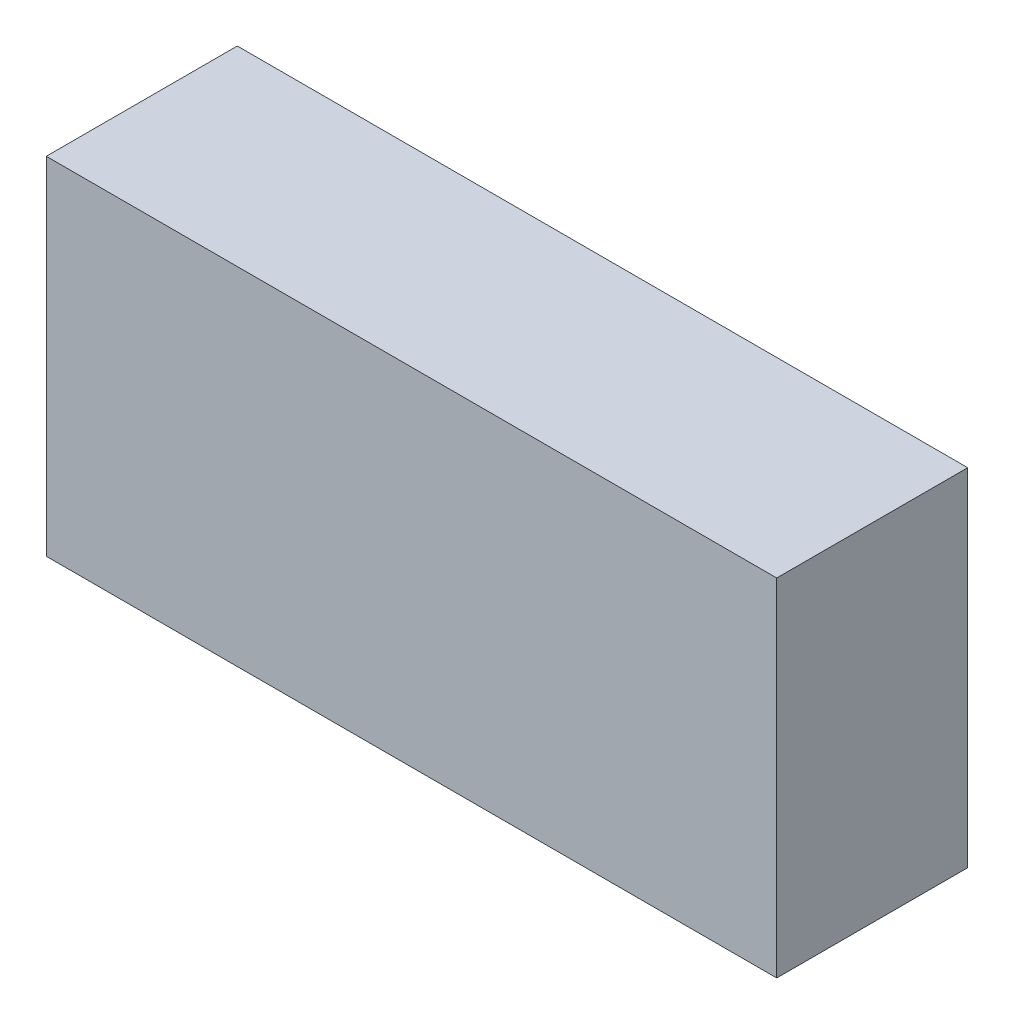
ISO-10303-21;
HEADER;
FILE_DESCRIPTION(('STEP AP214'),'2;1');
FILE_NAME('part.step','',(''),(''),'','','');
FILE_SCHEMA(('AUTOMOTIVE_DESIGN { 1 0 10303 214 1 1 1 1 }'));
ENDSEC;
DATA;
#1=APPLICATION_CONTEXT('core data for automotive mechanical design processes');
#2=APPLICATION_PROTOCOL_DEFINITION('international standard','automotive_design',2000,#1);
#3=PRODUCT_CONTEXT('',#1,'mechanical');
#4=PRODUCT('Part','Part','',(#3));
#5=PRODUCT_RELATED_PRODUCT_CATEGORY('part','',(#4));
#6=PRODUCT_DEFINITION_FORMATION('','',#4);
#7=PRODUCT_DEFINITION_CONTEXT('part definition',#1,'design');
#8=PRODUCT_DEFINITION('design','',#6,#7);
#9=PRODUCT_DEFINITION_SHAPE('','',#8);
#10=(LENGTH_UNIT() NAMED_UNIT(*) SI_UNIT(.MILLI.,.METRE.));
#11=(NAMED_UNIT(*) PLANE_ANGLE_UNIT() SI_UNIT($,.RADIAN.));
#12=(NAMED_UNIT(*) SI_UNIT($,.STERADIAN.) SOLID_ANGLE_UNIT());
#13=UNCERTAINTY_MEASURE_WITH_UNIT(LENGTH_MEASURE(1.E-05),#10,'distance_accuracy_value','');
#14=(GEOMETRIC_REPRESENTATION_CONTEXT(3) GLOBAL_UNCERTAINTY_ASSIGNED_CONTEXT((#13)) GLOBAL_UNIT_ASSIGNED_CONTEXT((#10,
#11,#12)) REPRESENTATION_CONTEXT('',''));
#15=CARTESIAN_POINT('',(0.,0.,0.));
#16=DIRECTION('',(0.,0.,1.));
#17=DIRECTION('',(1.,0.,0.));
#18=AXIS2_PLACEMENT_3D('',#15,#16,#17);
#19=CARTESIAN_POINT('',(-116.51078896083,39.9097499999997,-30.3276));
#20=DIRECTION('',(-1.,0.,0.));
#21=DIRECTION('',(0.,-1.,0.));
#22=AXIS2_PLACEMENT_3D('',#19,#20,#21);
#23=PLANE('',#22);
#24=DIRECTION('',(0.,0.,1.));
#25=VECTOR('',#24,1.);
#26=CARTESIAN_POINT('',(-116.51078896083,-65.5002500000003,-30.3276));
#27=LINE('',#26,#25);
#28=CARTESIAN_POINT('',(-116.51078896083,-65.5002500000003,-30.3276));
#29=VERTEX_POINT('',#28);
#30=CARTESIAN_POINT('',(-116.51078896083,-65.5002500000003,27.7876));
#31=VERTEX_POINT('',#30);
#32=EDGE_CURVE('E47',#29,#31,#27,.T.);
#33=ORIENTED_EDGE('',*,*,#32,.T.);
#34=DIRECTION('',(0.,-1.,0.));
#35=VECTOR('',#34,1.);
#36=CARTESIAN_POINT('',(-116.51078896083,39.9097499999997,27.7876));
#37=LINE('',#36,#35);
#38=CARTESIAN_POINT('',(-116.51078896083,39.9097499999997,27.7876));
#39=VERTEX_POINT('',#38);
#40=EDGE_CURVE('E89',#39,#31,#37,.T.);
#41=ORIENTED_EDGE('',*,*,#40,.F.);
#42=DIRECTION('',(0.,0.,1.));
#43=VECTOR('',#42,1.);
#44=CARTESIAN_POINT('',(-116.51078896083,39.9097499999997,-30.3276));
#45=LINE('',#44,#43);
#46=CARTESIAN_POINT('',(-116.51078896083,39.9097499999997,-30.3276));
#47=VERTEX_POINT('',#46);
#48=EDGE_CURVE('E11',#47,#39,#45,.T.);
#49=ORIENTED_EDGE('',*,*,#48,.F.);
#50=DIRECTION('',(0.,-1.,0.));
#51=VECTOR('',#50,1.);
#52=CARTESIAN_POINT('',(-116.51078896083,39.9097499999997,-30.3276));
#53=LINE('',#52,#51);
#54=EDGE_CURVE('E90',#47,#29,#53,.T.);
#55=ORIENTED_EDGE('',*,*,#54,.T.);
#56=EDGE_LOOP('',(#33,#41,#49,#55));
#57=FACE_BOUND('',#56,.T.);
#58=ADVANCED_FACE('F44',(#57),#23,.T.);
#59=CARTESIAN_POINT('',(-116.51078896083,39.9097499999997,-30.3276));
#60=DIRECTION('',(0.,1.,0.));
#61=DIRECTION('',(0.,0.,1.));
#62=AXIS2_PLACEMENT_3D('',#59,#60,#61);
#63=PLANE('',#62);
#64=ORIENTED_EDGE('',*,*,#48,.T.);
#65=DIRECTION('',(-1.,0.,0.));
#66=VECTOR('',#65,1.);
#67=CARTESIAN_POINT('',(-116.51078896083,39.9097499999997,27.7876));
#68=LINE('',#67,#66);
#69=CARTESIAN_POINT('',(105.73921103917,39.9097499999997,27.7876));
#70=VERTEX_POINT('',#69);
#71=EDGE_CURVE('E106',#70,#39,#68,.T.);
#72=ORIENTED_EDGE('',*,*,#71,.F.);
#73=DIRECTION('',(0.,0.,1.));
#74=VECTOR('',#73,1.);
#75=CARTESIAN_POINT('',(105.73921103917,39.9097499999997,-30.3276));
#76=LINE('',#75,#74);
#77=CARTESIAN_POINT('',(105.73921103917,39.9097499999997,-30.3276));
#78=VERTEX_POINT('',#77);
#79=EDGE_CURVE('E52',#78,#70,#76,.T.);
#80=ORIENTED_EDGE('',*,*,#79,.F.);
#81=DIRECTION('',(-1.,0.,0.));
#82=VECTOR('',#81,1.);
#83=CARTESIAN_POINT('',(-116.51078896083,39.9097499999997,-30.3276));
#84=LINE('',#83,#82);
#85=EDGE_CURVE('E95',#78,#47,#84,.T.);
#86=ORIENTED_EDGE('',*,*,#85,.T.);
#87=EDGE_LOOP('',(#64,#72,#80,#86));
#88=FACE_BOUND('',#87,.T.);
#89=ADVANCED_FACE('F124',(#88),#63,.T.);
#90=CARTESIAN_POINT('',(105.73921103917,39.9097499999997,-30.3276));
#91=DIRECTION('',(1.,0.,0.));
#92=DIRECTION('',(0.,1.,0.));
#93=AXIS2_PLACEMENT_3D('',#90,#91,#92);
#94=PLANE('',#93);
#95=ORIENTED_EDGE('',*,*,#79,.T.);
#96=DIRECTION('',(0.,1.,0.));
#97=VECTOR('',#96,1.);
#98=CARTESIAN_POINT('',(105.73921103917,39.9097499999997,27.7876));
#99=LINE('',#98,#97);
#100=CARTESIAN_POINT('',(105.73921103917,-65.5002500000003,27.7876));
#101=VERTEX_POINT('',#100);
#102=EDGE_CURVE('E102',#101,#70,#99,.T.);
#103=ORIENTED_EDGE('',*,*,#102,.F.);
#104=DIRECTION('',(0.,0.,1.));
#105=VECTOR('',#104,1.);
#106=CARTESIAN_POINT('',(105.73921103917,-65.5002500000003,-30.3276));
#107=LINE('',#106,#105);
#108=CARTESIAN_POINT('',(105.73921103917,-65.5002500000003,-30.3276));
#109=VERTEX_POINT('',#108);
#110=EDGE_CURVE('E94',#109,#101,#107,.T.);
#111=ORIENTED_EDGE('',*,*,#110,.F.);
#112=DIRECTION('',(0.,1.,0.));
#113=VECTOR('',#112,1.);
#114=CARTESIAN_POINT('',(105.73921103917,39.9097499999997,-30.3276));
#115=LINE('',#114,#113);
#116=EDGE_CURVE('E117',#109,#78,#115,.T.);
#117=ORIENTED_EDGE('',*,*,#116,.T.);
#118=EDGE_LOOP('',(#95,#103,#111,#117));
#119=FACE_BOUND('',#118,.T.);
#120=ADVANCED_FACE('F121',(#119),#94,.T.);
#121=CARTESIAN_POINT('',(-116.51078896083,-65.5002500000003,-30.3276));
#122=DIRECTION('',(0.,-1.,0.));
#123=DIRECTION('',(0.,0.,-1.));
#124=AXIS2_PLACEMENT_3D('',#121,#122,#123);
#125=PLANE('',#124);
#126=ORIENTED_EDGE('',*,*,#110,.T.);
#127=DIRECTION('',(1.,0.,0.));
#128=VECTOR('',#127,1.);
#129=CARTESIAN_POINT('',(-116.51078896083,-65.5002500000003,27.7876));
#130=LINE('',#129,#128);
#131=EDGE_CURVE('E97',#31,#101,#130,.T.);
#132=ORIENTED_EDGE('',*,*,#131,.F.);
#133=ORIENTED_EDGE('',*,*,#32,.F.);
#134=DIRECTION('',(1.,0.,0.));
#135=VECTOR('',#134,1.);
#136=CARTESIAN_POINT('',(-116.51078896083,-65.5002500000003,-30.3276));
#137=LINE('',#136,#135);
#138=EDGE_CURVE('E115',#29,#109,#137,.T.);
#139=ORIENTED_EDGE('',*,*,#138,.T.);
#140=EDGE_LOOP('',(#126,#132,#133,#139));
#141=FACE_BOUND('',#140,.T.);
#142=ADVANCED_FACE('F98',(#141),#125,.T.);
#143=CARTESIAN_POINT('',(0.,0.,-30.3276));
#144=DIRECTION('',(0.,0.,1.));
#145=DIRECTION('',(1.,0.,0.));
#146=AXIS2_PLACEMENT_3D('',#143,#144,#145);
#147=PLANE('',#146);
#148=ORIENTED_EDGE('',*,*,#54,.F.);
#149=ORIENTED_EDGE('',*,*,#85,.F.);
#150=ORIENTED_EDGE('',*,*,#116,.F.);
#151=ORIENTED_EDGE('',*,*,#138,.F.);
#152=EDGE_LOOP('',(#148,#149,#150,#151));
#153=FACE_BOUND('',#152,.T.);
#154=ADVANCED_FACE('F126',(#153),#147,.F.);
#155=CARTESIAN_POINT('',(0.,0.,27.7876));
#156=DIRECTION('',(0.,0.,1.));
#157=DIRECTION('',(1.,0.,0.));
#158=AXIS2_PLACEMENT_3D('',#155,#156,#157);
#159=PLANE('',#158);
#160=ORIENTED_EDGE('',*,*,#40,.T.);
#161=ORIENTED_EDGE('',*,*,#131,.T.);
#162=ORIENTED_EDGE('',*,*,#102,.T.);
#163=ORIENTED_EDGE('',*,*,#71,.T.);
#164=EDGE_LOOP('',(#160,#161,#162,#163));
#165=FACE_BOUND('',#164,.T.);
#166=ADVANCED_FACE('F105',(#165),#159,.T.);
#167=CLOSED_SHELL('',(#58,#89,#120,#142,#154,#166));
#168=MANIFOLD_SOLID_BREP('B2',#167);
#169=ADVANCED_BREP_SHAPE_REPRESENTATION('',(#18,#168),#14);
#170=SHAPE_DEFINITION_REPRESENTATION(#9,#169);
ENDSEC;
END-ISO-10303-21;
